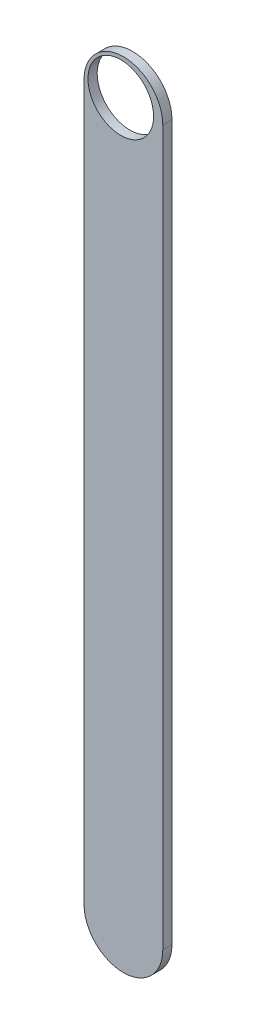
ISO-10303-21;
HEADER;
FILE_DESCRIPTION(('STEP AP214'),'2;1');
FILE_NAME('part.step','',(''),(''),'','','');
FILE_SCHEMA(('AUTOMOTIVE_DESIGN { 1 0 10303 214 1 1 1 1 }'));
ENDSEC;
DATA;
#1=APPLICATION_CONTEXT('core data for automotive mechanical design processes');
#2=APPLICATION_PROTOCOL_DEFINITION('international standard','automotive_design',2000,#1);
#3=PRODUCT_CONTEXT('',#1,'mechanical');
#4=PRODUCT('Part','Part','',(#3));
#5=PRODUCT_RELATED_PRODUCT_CATEGORY('part','',(#4));
#6=PRODUCT_DEFINITION_FORMATION('','',#4);
#7=PRODUCT_DEFINITION_CONTEXT('part definition',#1,'design');
#8=PRODUCT_DEFINITION('design','',#6,#7);
#9=PRODUCT_DEFINITION_SHAPE('','',#8);
#10=(LENGTH_UNIT() NAMED_UNIT(*) SI_UNIT(.MILLI.,.METRE.));
#11=(NAMED_UNIT(*) PLANE_ANGLE_UNIT() SI_UNIT($,.RADIAN.));
#12=(NAMED_UNIT(*) SI_UNIT($,.STERADIAN.) SOLID_ANGLE_UNIT());
#13=UNCERTAINTY_MEASURE_WITH_UNIT(LENGTH_MEASURE(1.E-05),#10,'distance_accuracy_value','');
#14=(GEOMETRIC_REPRESENTATION_CONTEXT(3) GLOBAL_UNCERTAINTY_ASSIGNED_CONTEXT((#13)) GLOBAL_UNIT_ASSIGNED_CONTEXT((#10,
#11,#12)) REPRESENTATION_CONTEXT('',''));
#15=CARTESIAN_POINT('',(0.,0.,0.));
#16=DIRECTION('',(0.,0.,1.));
#17=DIRECTION('',(1.,0.,0.));
#18=AXIS2_PLACEMENT_3D('',#15,#16,#17);
#19=CARTESIAN_POINT('',(127.99,-67.18,-0.045));
#20=DIRECTION('',(0.,0.,-1.));
#21=DIRECTION('',(-1.136868377216E-13,-1.,0.));
#22=AXIS2_PLACEMENT_3D('',#19,#20,#21);
#23=CYLINDRICAL_SURFACE('',#22,0.125);
#24=CARTESIAN_POINT('',(127.99,-67.18,1.6));
#25=DIRECTION('',(0.,0.,-1.));
#26=DIRECTION('',(-1.136868377216E-13,-1.,0.));
#27=AXIS2_PLACEMENT_3D('',#24,#25,#26);
#28=CIRCLE('',#27,0.125);
#29=CARTESIAN_POINT('',(127.99,-67.305,1.6));
#30=VERTEX_POINT('',#29);
#31=EDGE_CURVE('E115',#30,#30,#28,.T.);
#32=ORIENTED_EDGE('',*,*,#31,.T.);
#33=DIRECTION('',(0.,0.,1.));
#34=VECTOR('',#33,1.);
#35=CARTESIAN_POINT('',(127.99,-67.305,-0.045));
#36=LINE('',#35,#34);
#37=CARTESIAN_POINT('',(127.99,-67.305,1.635));
#38=VERTEX_POINT('',#37);
#39=EDGE_CURVE('E11',#30,#38,#36,.T.);
#40=ORIENTED_EDGE('',*,*,#39,.T.);
#41=CARTESIAN_POINT('',(127.99,-67.18,1.635));
#42=DIRECTION('',(0.,0.,-1.));
#43=DIRECTION('',(-1.136868377216E-13,-1.,0.));
#44=AXIS2_PLACEMENT_3D('',#41,#42,#43);
#45=CIRCLE('',#44,0.125);
#46=EDGE_CURVE('E20',#38,#38,#45,.T.);
#47=ORIENTED_EDGE('',*,*,#46,.F.);
#48=ORIENTED_EDGE('',*,*,#39,.F.);
#49=EDGE_LOOP('',(#32,#40,#47,#48));
#50=FACE_BOUND('',#49,.T.);
#51=ADVANCED_FACE('F17',(#50),#23,.F.);
#52=CARTESIAN_POINT('',(127.85,-67.19,1.6));
#53=DIRECTION('',(1.,0.,0.));
#54=DIRECTION('',(0.,1.,0.));
#55=AXIS2_PLACEMENT_3D('',#52,#53,#54);
#56=PLANE('',#55);
#57=DIRECTION('',(0.,-1.,0.));
#58=VECTOR('',#57,1.);
#59=CARTESIAN_POINT('',(127.85,-67.19,1.6));
#60=LINE('',#59,#58);
#61=CARTESIAN_POINT('',(127.85,-67.19,1.6));
#62=VERTEX_POINT('',#61);
#63=CARTESIAN_POINT('',(127.85,-69.9125,1.6));
#64=VERTEX_POINT('',#63);
#65=EDGE_CURVE('E113',#62,#64,#60,.T.);
#66=ORIENTED_EDGE('',*,*,#65,.T.);
#67=DIRECTION('',(0.,0.,1.));
#68=VECTOR('',#67,1.);
#69=CARTESIAN_POINT('',(127.85,-69.9125,1.6));
#70=LINE('',#69,#68);
#71=CARTESIAN_POINT('',(127.85,-69.9125,1.635));
#72=VERTEX_POINT('',#71);
#73=EDGE_CURVE('E81',#64,#72,#70,.T.);
#74=ORIENTED_EDGE('',*,*,#73,.T.);
#75=DIRECTION('',(0.,-1.,0.));
#76=VECTOR('',#75,1.);
#77=CARTESIAN_POINT('',(127.85,-67.19,1.635));
#78=LINE('',#77,#76);
#79=CARTESIAN_POINT('',(127.85,-67.19,1.635));
#80=VERTEX_POINT('',#79);
#81=EDGE_CURVE('E129',#80,#72,#78,.T.);
#82=ORIENTED_EDGE('',*,*,#81,.F.);
#83=DIRECTION('',(0.,0.,1.));
#84=VECTOR('',#83,1.);
#85=CARTESIAN_POINT('',(127.85,-67.19,1.6));
#86=LINE('',#85,#84);
#87=EDGE_CURVE('E119',#62,#80,#86,.T.);
#88=ORIENTED_EDGE('',*,*,#87,.F.);
#89=EDGE_LOOP('',(#66,#74,#82,#88));
#90=FACE_BOUND('',#89,.T.);
#91=ADVANCED_FACE('F153',(#90),#56,.F.);
#92=CARTESIAN_POINT('',(128.15,-69.9125,1.635));
#93=DIRECTION('',(0.,0.,1.));
#94=DIRECTION('',(1.,0.,0.));
#95=AXIS2_PLACEMENT_3D('',#92,#93,#94);
#96=PLANE('',#95);
#97=ORIENTED_EDGE('',*,*,#46,.T.);
#98=EDGE_LOOP('',(#97));
#99=FACE_BOUND('',#98,.T.);
#100=DIRECTION('',(0.,1.,0.));
#101=VECTOR('',#100,1.);
#102=CARTESIAN_POINT('',(128.15,-69.9125,1.635));
#103=LINE('',#102,#101);
#104=CARTESIAN_POINT('',(128.15,-69.9125,1.635));
#105=VERTEX_POINT('',#104);
#106=CARTESIAN_POINT('',(128.15,-67.19,1.635));
#107=VERTEX_POINT('',#106);
#108=EDGE_CURVE('E93',#105,#107,#103,.T.);
#109=ORIENTED_EDGE('',*,*,#108,.T.);
#110=CARTESIAN_POINT('',(128.,-67.19,1.635));
#111=DIRECTION('',(0.,0.,1.));
#112=DIRECTION('',(1.,0.,0.));
#113=AXIS2_PLACEMENT_3D('',#110,#111,#112);
#114=CIRCLE('',#113,0.15);
#115=EDGE_CURVE('E109',#107,#80,#114,.T.);
#116=ORIENTED_EDGE('',*,*,#115,.T.);
#117=ORIENTED_EDGE('',*,*,#81,.T.);
#118=CARTESIAN_POINT('',(128.,-69.9125,1.635));
#119=DIRECTION('',(0.,0.,1.));
#120=DIRECTION('',(-1.,0.,0.));
#121=AXIS2_PLACEMENT_3D('',#118,#119,#120);
#122=CIRCLE('',#121,0.15);
#123=EDGE_CURVE('E85',#72,#105,#122,.T.);
#124=ORIENTED_EDGE('',*,*,#123,.T.);
#125=EDGE_LOOP('',(#109,#116,#117,#124));
#126=FACE_BOUND('',#125,.T.);
#127=ADVANCED_FACE('F139',(#99,#126),#96,.T.);
#128=CARTESIAN_POINT('',(128.15,-69.9125,1.6));
#129=DIRECTION('',(0.,0.,1.));
#130=DIRECTION('',(1.,0.,0.));
#131=AXIS2_PLACEMENT_3D('',#128,#129,#130);
#132=PLANE('',#131);
#133=ORIENTED_EDGE('',*,*,#31,.F.);
#134=EDGE_LOOP('',(#133));
#135=FACE_BOUND('',#134,.T.);
#136=CARTESIAN_POINT('',(128.,-69.9125,1.6));
#137=DIRECTION('',(0.,0.,1.));
#138=DIRECTION('',(-1.,0.,0.));
#139=AXIS2_PLACEMENT_3D('',#136,#137,#138);
#140=CIRCLE('',#139,0.15);
#141=CARTESIAN_POINT('',(128.15,-69.9125,1.6));
#142=VERTEX_POINT('',#141);
#143=EDGE_CURVE('E74',#64,#142,#140,.T.);
#144=ORIENTED_EDGE('',*,*,#143,.F.);
#145=ORIENTED_EDGE('',*,*,#65,.F.);
#146=CARTESIAN_POINT('',(128.,-67.19,1.6));
#147=DIRECTION('',(0.,0.,1.));
#148=DIRECTION('',(1.,0.,0.));
#149=AXIS2_PLACEMENT_3D('',#146,#147,#148);
#150=CIRCLE('',#149,0.15);
#151=CARTESIAN_POINT('',(128.15,-67.19,1.6));
#152=VERTEX_POINT('',#151);
#153=EDGE_CURVE('E98',#152,#62,#150,.T.);
#154=ORIENTED_EDGE('',*,*,#153,.F.);
#155=DIRECTION('',(0.,1.,0.));
#156=VECTOR('',#155,1.);
#157=CARTESIAN_POINT('',(128.15,-69.9125,1.6));
#158=LINE('',#157,#156);
#159=EDGE_CURVE('E91',#142,#152,#158,.T.);
#160=ORIENTED_EDGE('',*,*,#159,.F.);
#161=EDGE_LOOP('',(#144,#145,#154,#160));
#162=FACE_BOUND('',#161,.T.);
#163=ADVANCED_FACE('F96',(#135,#162),#132,.F.);
#164=CARTESIAN_POINT('',(128.,-67.19,1.6));
#165=DIRECTION('',(0.,0.,-1.));
#166=DIRECTION('',(1.,0.,0.));
#167=AXIS2_PLACEMENT_3D('',#164,#165,#166);
#168=CYLINDRICAL_SURFACE('',#167,0.15);
#169=ORIENTED_EDGE('',*,*,#153,.T.);
#170=ORIENTED_EDGE('',*,*,#87,.T.);
#171=ORIENTED_EDGE('',*,*,#115,.F.);
#172=DIRECTION('',(0.,0.,1.));
#173=VECTOR('',#172,1.);
#174=CARTESIAN_POINT('',(128.15,-67.19,1.6));
#175=LINE('',#174,#173);
#176=EDGE_CURVE('E101',#152,#107,#175,.T.);
#177=ORIENTED_EDGE('',*,*,#176,.F.);
#178=EDGE_LOOP('',(#169,#170,#171,#177));
#179=FACE_BOUND('',#178,.T.);
#180=ADVANCED_FACE('F143',(#179),#168,.T.);
#181=CARTESIAN_POINT('',(128.,-69.9125,1.6));
#182=DIRECTION('',(0.,0.,-1.));
#183=DIRECTION('',(-1.,0.,0.));
#184=AXIS2_PLACEMENT_3D('',#181,#182,#183);
#185=CYLINDRICAL_SURFACE('',#184,0.15);
#186=ORIENTED_EDGE('',*,*,#143,.T.);
#187=DIRECTION('',(0.,0.,1.));
#188=VECTOR('',#187,1.);
#189=CARTESIAN_POINT('',(128.15,-69.9125,1.6));
#190=LINE('',#189,#188);
#191=EDGE_CURVE('E78',#142,#105,#190,.T.);
#192=ORIENTED_EDGE('',*,*,#191,.T.);
#193=ORIENTED_EDGE('',*,*,#123,.F.);
#194=ORIENTED_EDGE('',*,*,#73,.F.);
#195=EDGE_LOOP('',(#186,#192,#193,#194));
#196=FACE_BOUND('',#195,.T.);
#197=ADVANCED_FACE('F76',(#196),#185,.T.);
#198=CARTESIAN_POINT('',(128.15,-69.9125,1.6));
#199=DIRECTION('',(-1.,0.,0.));
#200=DIRECTION('',(0.,0.,1.));
#201=AXIS2_PLACEMENT_3D('',#198,#199,#200);
#202=PLANE('',#201);
#203=ORIENTED_EDGE('',*,*,#159,.T.);
#204=ORIENTED_EDGE('',*,*,#176,.T.);
#205=ORIENTED_EDGE('',*,*,#108,.F.);
#206=ORIENTED_EDGE('',*,*,#191,.F.);
#207=EDGE_LOOP('',(#203,#204,#205,#206));
#208=FACE_BOUND('',#207,.T.);
#209=ADVANCED_FACE('F89',(#208),#202,.F.);
#210=CLOSED_SHELL('',(#51,#91,#127,#163,#180,#197,#209));
#211=MANIFOLD_SOLID_BREP('B1',#210);
#212=ADVANCED_BREP_SHAPE_REPRESENTATION('',(#18,#211),#14);
#213=SHAPE_DEFINITION_REPRESENTATION(#9,#212);
ENDSEC;
END-ISO-10303-21;
